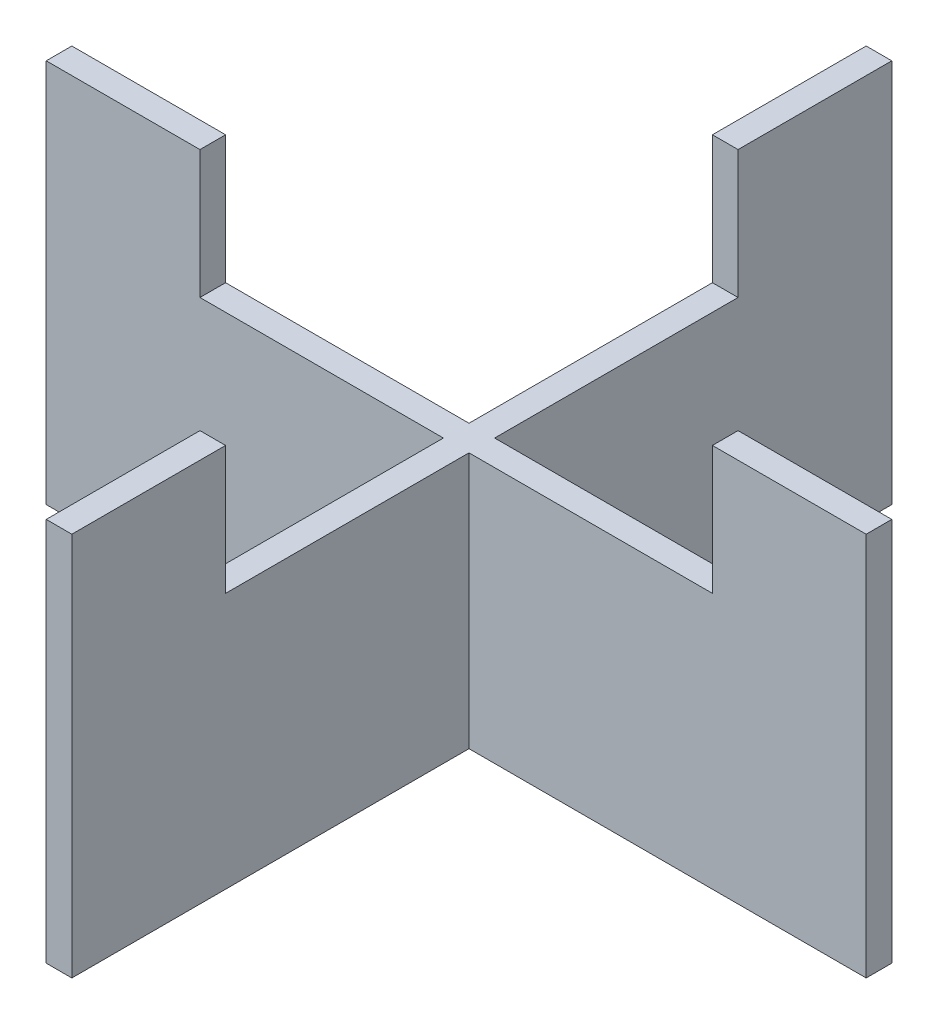
ISO-10303-21;
HEADER;
FILE_DESCRIPTION(('STEP AP214'),'2;1');
FILE_NAME('part.step','',(''),(''),'','','');
FILE_SCHEMA(('AUTOMOTIVE_DESIGN { 1 0 10303 214 1 1 1 1 }'));
ENDSEC;
DATA;
#1=APPLICATION_CONTEXT('core data for automotive mechanical design processes');
#2=APPLICATION_PROTOCOL_DEFINITION('international standard','automotive_design',2000,#1);
#3=PRODUCT_CONTEXT('',#1,'mechanical');
#4=PRODUCT('Part','Part','',(#3));
#5=PRODUCT_RELATED_PRODUCT_CATEGORY('part','',(#4));
#6=PRODUCT_DEFINITION_FORMATION('','',#4);
#7=PRODUCT_DEFINITION_CONTEXT('part definition',#1,'design');
#8=PRODUCT_DEFINITION('design','',#6,#7);
#9=PRODUCT_DEFINITION_SHAPE('','',#8);
#10=(LENGTH_UNIT() NAMED_UNIT(*) SI_UNIT(.MILLI.,.METRE.));
#11=(NAMED_UNIT(*) PLANE_ANGLE_UNIT() SI_UNIT($,.RADIAN.));
#12=(NAMED_UNIT(*) SI_UNIT($,.STERADIAN.) SOLID_ANGLE_UNIT());
#13=UNCERTAINTY_MEASURE_WITH_UNIT(LENGTH_MEASURE(1.E-05),#10,'distance_accuracy_value','');
#14=(GEOMETRIC_REPRESENTATION_CONTEXT(3) GLOBAL_UNCERTAINTY_ASSIGNED_CONTEXT((#13)) GLOBAL_UNIT_ASSIGNED_CONTEXT((#10,
#11,#12)) REPRESENTATION_CONTEXT('',''));
#15=CARTESIAN_POINT('',(0.,0.,0.));
#16=DIRECTION('',(0.,0.,1.));
#17=DIRECTION('',(1.,0.,0.));
#18=AXIS2_PLACEMENT_3D('',#15,#16,#17);
#19=CARTESIAN_POINT('',(0.,15.,0.));
#20=DIRECTION('',(0.,1.,0.));
#21=DIRECTION('',(0.,0.,1.));
#22=AXIS2_PLACEMENT_3D('',#19,#20,#21);
#23=PLANE('',#22);
#24=DIRECTION('',(0.,0.,-1.));
#25=VECTOR('',#24,1.);
#26=CARTESIAN_POINT('',(26.,15.,0.));
#27=LINE('',#26,#25);
#28=CARTESIAN_POINT('',(26.,15.,0.));
#29=VERTEX_POINT('',#28);
#30=CARTESIAN_POINT('',(26.,15.,-0.999999999999997));
#31=VERTEX_POINT('',#30);
#32=EDGE_CURVE('E40',#29,#31,#27,.T.);
#33=ORIENTED_EDGE('',*,*,#32,.F.);
#34=DIRECTION('',(1.,0.,0.));
#35=VECTOR('',#34,1.);
#36=CARTESIAN_POINT('',(16.5,15.,0.));
#37=LINE('',#36,#35);
#38=CARTESIAN_POINT('',(32.,15.,0.));
#39=VERTEX_POINT('',#38);
#40=EDGE_CURVE('E248',#29,#39,#37,.T.);
#41=ORIENTED_EDGE('',*,*,#40,.T.);
#42=DIRECTION('',(0.,0.,-1.));
#43=VECTOR('',#42,1.);
#44=CARTESIAN_POINT('',(32.,15.,0.));
#45=LINE('',#44,#43);
#46=CARTESIAN_POINT('',(32.,15.,-0.999999999999999));
#47=VERTEX_POINT('',#46);
#48=EDGE_CURVE('E246',#39,#47,#45,.T.);
#49=ORIENTED_EDGE('',*,*,#48,.T.);
#50=DIRECTION('',(-1.,0.,0.));
#51=VECTOR('',#50,1.);
#52=CARTESIAN_POINT('',(32.,15.,-0.999999999999999));
#53=LINE('',#52,#51);
#54=EDGE_CURVE('E136',#47,#31,#53,.T.);
#55=ORIENTED_EDGE('',*,*,#54,.T.);
#56=EDGE_LOOP('',(#33,#41,#49,#55));
#57=FACE_BOUND('',#56,.T.);
#58=ADVANCED_FACE('F32',(#57),#23,.T.);
#59=DIRECTION('',(1.,0.,0.));
#60=VECTOR('',#59,1.);
#61=CARTESIAN_POINT('',(0.,15.,9.5));
#62=LINE('',#61,#60);
#63=CARTESIAN_POINT('',(15.5,15.,9.5));
#64=VERTEX_POINT('',#63);
#65=CARTESIAN_POINT('',(16.5,15.,9.5));
#66=VERTEX_POINT('',#65);
#67=EDGE_CURVE('E214',#64,#66,#62,.T.);
#68=ORIENTED_EDGE('',*,*,#67,.F.);
#69=DIRECTION('',(0.,0.,1.));
#70=VECTOR('',#69,1.);
#71=CARTESIAN_POINT('',(15.5,15.,0.));
#72=LINE('',#71,#70);
#73=CARTESIAN_POINT('',(15.5,15.,15.5));
#74=VERTEX_POINT('',#73);
#75=EDGE_CURVE('E257',#64,#74,#72,.T.);
#76=ORIENTED_EDGE('',*,*,#75,.T.);
#77=DIRECTION('',(1.,0.,0.));
#78=VECTOR('',#77,1.);
#79=CARTESIAN_POINT('',(15.5,15.,15.5));
#80=LINE('',#79,#78);
#81=CARTESIAN_POINT('',(16.5,15.,15.5));
#82=VERTEX_POINT('',#81);
#83=EDGE_CURVE('E255',#74,#82,#80,.T.);
#84=ORIENTED_EDGE('',*,*,#83,.T.);
#85=DIRECTION('',(0.,0.,-1.));
#86=VECTOR('',#85,1.);
#87=CARTESIAN_POINT('',(16.5,15.,15.5));
#88=LINE('',#87,#86);
#89=EDGE_CURVE('E252',#82,#66,#88,.T.);
#90=ORIENTED_EDGE('',*,*,#89,.T.);
#91=EDGE_LOOP('',(#68,#76,#84,#90));
#92=FACE_BOUND('',#91,.T.);
#93=ADVANCED_FACE('F352',(#92),#23,.T.);
#94=DIRECTION('',(0.,0.,1.));
#95=VECTOR('',#94,1.);
#96=CARTESIAN_POINT('',(6.,15.,0.));
#97=LINE('',#96,#95);
#98=CARTESIAN_POINT('',(6.,15.,-0.999999999999996));
#99=VERTEX_POINT('',#98);
#100=CARTESIAN_POINT('',(6.,15.,0.));
#101=VERTEX_POINT('',#100);
#102=EDGE_CURVE('E211',#99,#101,#97,.T.);
#103=ORIENTED_EDGE('',*,*,#102,.F.);
#104=DIRECTION('',(-1.,0.,0.));
#105=VECTOR('',#104,1.);
#106=CARTESIAN_POINT('',(15.5,15.,-0.999999999999994));
#107=LINE('',#106,#105);
#108=CARTESIAN_POINT('',(0.,15.,-0.999999999999997));
#109=VERTEX_POINT('',#108);
#110=EDGE_CURVE('E56',#99,#109,#107,.T.);
#111=ORIENTED_EDGE('',*,*,#110,.T.);
#112=DIRECTION('',(0.,0.,1.));
#113=VECTOR('',#112,1.);
#114=CARTESIAN_POINT('',(0.,15.,-0.999999999999997));
#115=LINE('',#114,#113);
#116=CARTESIAN_POINT('',(0.,15.,0.));
#117=VERTEX_POINT('',#116);
#118=EDGE_CURVE('E186',#109,#117,#115,.T.);
#119=ORIENTED_EDGE('',*,*,#118,.T.);
#120=DIRECTION('',(1.,0.,0.));
#121=VECTOR('',#120,1.);
#122=CARTESIAN_POINT('',(0.,15.,0.));
#123=LINE('',#122,#121);
#124=EDGE_CURVE('E110',#117,#101,#123,.T.);
#125=ORIENTED_EDGE('',*,*,#124,.T.);
#126=EDGE_LOOP('',(#103,#111,#119,#125));
#127=FACE_BOUND('',#126,.T.);
#128=ADVANCED_FACE('F383',(#127),#23,.T.);
#129=CARTESIAN_POINT('',(0.,15.,-0.999999999999997));
#130=DIRECTION('',(1.,0.,0.));
#131=DIRECTION('',(0.,0.,-1.));
#132=AXIS2_PLACEMENT_3D('',#129,#130,#131);
#133=PLANE('',#132);
#134=DIRECTION('',(0.,0.,1.));
#135=VECTOR('',#134,1.);
#136=CARTESIAN_POINT('',(0.,0.,-0.999999999999997));
#137=LINE('',#136,#135);
#138=CARTESIAN_POINT('',(0.,0.,-0.999999999999997));
#139=VERTEX_POINT('',#138);
#140=CARTESIAN_POINT('',(0.,0.,0.));
#141=VERTEX_POINT('',#140);
#142=EDGE_CURVE('E158',#139,#141,#137,.T.);
#143=ORIENTED_EDGE('',*,*,#142,.T.);
#144=DIRECTION('',(0.,-1.,0.));
#145=VECTOR('',#144,1.);
#146=CARTESIAN_POINT('',(0.,15.,0.));
#147=LINE('',#146,#145);
#148=EDGE_CURVE('E208',#117,#141,#147,.T.);
#149=ORIENTED_EDGE('',*,*,#148,.F.);
#150=ORIENTED_EDGE('',*,*,#118,.F.);
#151=DIRECTION('',(0.,-1.,0.));
#152=VECTOR('',#151,1.);
#153=CARTESIAN_POINT('',(0.,15.,-0.999999999999997));
#154=LINE('',#153,#152);
#155=EDGE_CURVE('E157',#109,#139,#154,.T.);
#156=ORIENTED_EDGE('',*,*,#155,.T.);
#157=EDGE_LOOP('',(#143,#149,#150,#156));
#158=FACE_BOUND('',#157,.T.);
#159=ADVANCED_FACE('F34',(#158),#133,.F.);
#160=CARTESIAN_POINT('',(0.,15.,0.));
#161=DIRECTION('',(0.,0.,-1.));
#162=DIRECTION('',(-1.,0.,0.));
#163=AXIS2_PLACEMENT_3D('',#160,#161,#162);
#164=PLANE('',#163);
#165=DIRECTION('',(1.,0.,0.));
#166=VECTOR('',#165,1.);
#167=CARTESIAN_POINT('',(0.,10.,0.));
#168=LINE('',#167,#166);
#169=CARTESIAN_POINT('',(6.,10.,0.));
#170=VERTEX_POINT('',#169);
#171=CARTESIAN_POINT('',(15.5,10.,0.));
#172=VERTEX_POINT('',#171);
#173=EDGE_CURVE('E162',#170,#172,#168,.T.);
#174=ORIENTED_EDGE('',*,*,#173,.F.);
#175=DIRECTION('',(0.,1.,0.));
#176=VECTOR('',#175,1.);
#177=CARTESIAN_POINT('',(6.,15.,0.));
#178=LINE('',#177,#176);
#179=EDGE_CURVE('E285',#170,#101,#178,.T.);
#180=ORIENTED_EDGE('',*,*,#179,.T.);
#181=ORIENTED_EDGE('',*,*,#124,.F.);
#182=ORIENTED_EDGE('',*,*,#148,.T.);
#183=DIRECTION('',(1.,0.,0.));
#184=VECTOR('',#183,1.);
#185=CARTESIAN_POINT('',(0.,0.,0.));
#186=LINE('',#185,#184);
#187=CARTESIAN_POINT('',(15.5,0.,0.));
#188=VERTEX_POINT('',#187);
#189=EDGE_CURVE('E161',#141,#188,#186,.T.);
#190=ORIENTED_EDGE('',*,*,#189,.T.);
#191=DIRECTION('',(0.,-1.,0.));
#192=VECTOR('',#191,1.);
#193=CARTESIAN_POINT('',(15.5,15.,0.));
#194=LINE('',#193,#192);
#195=EDGE_CURVE('E206',#172,#188,#194,.T.);
#196=ORIENTED_EDGE('',*,*,#195,.F.);
#197=EDGE_LOOP('',(#174,#180,#181,#182,#190,#196));
#198=FACE_BOUND('',#197,.T.);
#199=ADVANCED_FACE('F336',(#198),#164,.F.);
#200=CARTESIAN_POINT('',(15.5,15.,0.));
#201=DIRECTION('',(1.,0.,0.));
#202=DIRECTION('',(0.,0.,-1.));
#203=AXIS2_PLACEMENT_3D('',#200,#201,#202);
#204=PLANE('',#203);
#205=ORIENTED_EDGE('',*,*,#75,.F.);
#206=DIRECTION('',(0.,-1.,0.));
#207=VECTOR('',#206,1.);
#208=CARTESIAN_POINT('',(15.5,15.,9.5));
#209=LINE('',#208,#207);
#210=CARTESIAN_POINT('',(15.5,10.,9.5));
#211=VERTEX_POINT('',#210);
#212=EDGE_CURVE('E243',#64,#211,#209,.T.);
#213=ORIENTED_EDGE('',*,*,#212,.T.);
#214=DIRECTION('',(0.,0.,1.));
#215=VECTOR('',#214,1.);
#216=CARTESIAN_POINT('',(15.5,10.,0.));
#217=LINE('',#216,#215);
#218=EDGE_CURVE('E263',#172,#211,#217,.T.);
#219=ORIENTED_EDGE('',*,*,#218,.F.);
#220=ORIENTED_EDGE('',*,*,#195,.T.);
#221=DIRECTION('',(0.,0.,1.));
#222=VECTOR('',#221,1.);
#223=CARTESIAN_POINT('',(15.5,0.,0.));
#224=LINE('',#223,#222);
#225=CARTESIAN_POINT('',(15.5,0.,15.5));
#226=VERTEX_POINT('',#225);
#227=EDGE_CURVE('E165',#188,#226,#224,.T.);
#228=ORIENTED_EDGE('',*,*,#227,.T.);
#229=DIRECTION('',(0.,-1.,0.));
#230=VECTOR('',#229,1.);
#231=CARTESIAN_POINT('',(15.5,15.,15.5));
#232=LINE('',#231,#230);
#233=EDGE_CURVE('E203',#74,#226,#232,.T.);
#234=ORIENTED_EDGE('',*,*,#233,.F.);
#235=EDGE_LOOP('',(#205,#213,#219,#220,#228,#234));
#236=FACE_BOUND('',#235,.T.);
#237=ADVANCED_FACE('F334',(#236),#204,.F.);
#238=CARTESIAN_POINT('',(15.5,15.,15.5));
#239=DIRECTION('',(0.,0.,-1.));
#240=DIRECTION('',(-1.,0.,0.));
#241=AXIS2_PLACEMENT_3D('',#238,#239,#240);
#242=PLANE('',#241);
#243=DIRECTION('',(1.,0.,0.));
#244=VECTOR('',#243,1.);
#245=CARTESIAN_POINT('',(15.5,0.,15.5));
#246=LINE('',#245,#244);
#247=CARTESIAN_POINT('',(16.5,0.,15.5));
#248=VERTEX_POINT('',#247);
#249=EDGE_CURVE('E167',#226,#248,#246,.T.);
#250=ORIENTED_EDGE('',*,*,#249,.T.);
#251=DIRECTION('',(0.,-1.,0.));
#252=VECTOR('',#251,1.);
#253=CARTESIAN_POINT('',(16.5,15.,15.5));
#254=LINE('',#253,#252);
#255=EDGE_CURVE('E200',#82,#248,#254,.T.);
#256=ORIENTED_EDGE('',*,*,#255,.F.);
#257=ORIENTED_EDGE('',*,*,#83,.F.);
#258=ORIENTED_EDGE('',*,*,#233,.T.);
#259=EDGE_LOOP('',(#250,#256,#257,#258));
#260=FACE_BOUND('',#259,.T.);
#261=ADVANCED_FACE('F347',(#260),#242,.F.);
#262=CARTESIAN_POINT('',(16.5,15.,15.5));
#263=DIRECTION('',(-1.,0.,0.));
#264=DIRECTION('',(0.,0.,1.));
#265=AXIS2_PLACEMENT_3D('',#262,#263,#264);
#266=PLANE('',#265);
#267=DIRECTION('',(0.,0.,-1.));
#268=VECTOR('',#267,1.);
#269=CARTESIAN_POINT('',(16.5,10.,15.5));
#270=LINE('',#269,#268);
#271=CARTESIAN_POINT('',(16.5,10.,9.5));
#272=VERTEX_POINT('',#271);
#273=CARTESIAN_POINT('',(16.5,10.,0.));
#274=VERTEX_POINT('',#273);
#275=EDGE_CURVE('E266',#272,#274,#270,.T.);
#276=ORIENTED_EDGE('',*,*,#275,.F.);
#277=DIRECTION('',(0.,1.,0.));
#278=VECTOR('',#277,1.);
#279=CARTESIAN_POINT('',(16.5,15.,9.5));
#280=LINE('',#279,#278);
#281=EDGE_CURVE('E282',#272,#66,#280,.T.);
#282=ORIENTED_EDGE('',*,*,#281,.T.);
#283=ORIENTED_EDGE('',*,*,#89,.F.);
#284=ORIENTED_EDGE('',*,*,#255,.T.);
#285=DIRECTION('',(0.,0.,-1.));
#286=VECTOR('',#285,1.);
#287=CARTESIAN_POINT('',(16.5,0.,15.5));
#288=LINE('',#287,#286);
#289=CARTESIAN_POINT('',(16.5,0.,0.));
#290=VERTEX_POINT('',#289);
#291=EDGE_CURVE('E169',#248,#290,#288,.T.);
#292=ORIENTED_EDGE('',*,*,#291,.T.);
#293=DIRECTION('',(0.,-1.,0.));
#294=VECTOR('',#293,1.);
#295=CARTESIAN_POINT('',(16.5,15.,0.));
#296=LINE('',#295,#294);
#297=EDGE_CURVE('E198',#274,#290,#296,.T.);
#298=ORIENTED_EDGE('',*,*,#297,.F.);
#299=EDGE_LOOP('',(#276,#282,#283,#284,#292,#298));
#300=FACE_BOUND('',#299,.T.);
#301=ADVANCED_FACE('F399',(#300),#266,.F.);
#302=CARTESIAN_POINT('',(16.5,15.,0.));
#303=DIRECTION('',(0.,0.,-1.));
#304=DIRECTION('',(-1.,0.,0.));
#305=AXIS2_PLACEMENT_3D('',#302,#303,#304);
#306=PLANE('',#305);
#307=ORIENTED_EDGE('',*,*,#40,.F.);
#308=DIRECTION('',(0.,-1.,0.));
#309=VECTOR('',#308,1.);
#310=CARTESIAN_POINT('',(26.,15.,0.));
#311=LINE('',#310,#309);
#312=CARTESIAN_POINT('',(26.,10.,0.));
#313=VERTEX_POINT('',#312);
#314=EDGE_CURVE('E230',#29,#313,#311,.T.);
#315=ORIENTED_EDGE('',*,*,#314,.T.);
#316=DIRECTION('',(1.,0.,0.));
#317=VECTOR('',#316,1.);
#318=CARTESIAN_POINT('',(16.5,10.,0.));
#319=LINE('',#318,#317);
#320=EDGE_CURVE('E269',#274,#313,#319,.T.);
#321=ORIENTED_EDGE('',*,*,#320,.F.);
#322=ORIENTED_EDGE('',*,*,#297,.T.);
#323=DIRECTION('',(1.,0.,0.));
#324=VECTOR('',#323,1.);
#325=CARTESIAN_POINT('',(16.5,0.,0.));
#326=LINE('',#325,#324);
#327=CARTESIAN_POINT('',(32.,0.,0.));
#328=VERTEX_POINT('',#327);
#329=EDGE_CURVE('E172',#290,#328,#326,.T.);
#330=ORIENTED_EDGE('',*,*,#329,.T.);
#331=DIRECTION('',(0.,-1.,0.));
#332=VECTOR('',#331,1.);
#333=CARTESIAN_POINT('',(32.,15.,0.));
#334=LINE('',#333,#332);
#335=EDGE_CURVE('E195',#39,#328,#334,.T.);
#336=ORIENTED_EDGE('',*,*,#335,.F.);
#337=EDGE_LOOP('',(#307,#315,#321,#322,#330,#336));
#338=FACE_BOUND('',#337,.T.);
#339=ADVANCED_FACE('F313',(#338),#306,.F.);
#340=CARTESIAN_POINT('',(32.,15.,0.));
#341=DIRECTION('',(-1.,0.,0.));
#342=DIRECTION('',(0.,0.,1.));
#343=AXIS2_PLACEMENT_3D('',#340,#341,#342);
#344=PLANE('',#343);
#345=DIRECTION('',(0.,0.,-1.));
#346=VECTOR('',#345,1.);
#347=CARTESIAN_POINT('',(32.,0.,0.));
#348=LINE('',#347,#346);
#349=CARTESIAN_POINT('',(32.,0.,-0.999999999999999));
#350=VERTEX_POINT('',#349);
#351=EDGE_CURVE('E174',#328,#350,#348,.T.);
#352=ORIENTED_EDGE('',*,*,#351,.T.);
#353=DIRECTION('',(0.,-1.,0.));
#354=VECTOR('',#353,1.);
#355=CARTESIAN_POINT('',(32.,15.,-0.999999999999999));
#356=LINE('',#355,#354);
#357=EDGE_CURVE('E192',#47,#350,#356,.T.);
#358=ORIENTED_EDGE('',*,*,#357,.F.);
#359=ORIENTED_EDGE('',*,*,#48,.F.);
#360=ORIENTED_EDGE('',*,*,#335,.T.);
#361=EDGE_LOOP('',(#352,#358,#359,#360));
#362=FACE_BOUND('',#361,.T.);
#363=ADVANCED_FACE('F391',(#362),#344,.F.);
#364=CARTESIAN_POINT('',(32.,15.,-0.999999999999999));
#365=DIRECTION('',(0.,0.,1.));
#366=DIRECTION('',(1.,0.,0.));
#367=AXIS2_PLACEMENT_3D('',#364,#365,#366);
#368=PLANE('',#367);
#369=DIRECTION('',(-1.,0.,0.));
#370=VECTOR('',#369,1.);
#371=CARTESIAN_POINT('',(32.,10.,-0.999999999999999));
#372=LINE('',#371,#370);
#373=CARTESIAN_POINT('',(26.,10.,-0.999999999999997));
#374=VERTEX_POINT('',#373);
#375=CARTESIAN_POINT('',(16.5,10.,-0.999999999999996));
#376=VERTEX_POINT('',#375);
#377=EDGE_CURVE('E242',#374,#376,#372,.T.);
#378=ORIENTED_EDGE('',*,*,#377,.F.);
#379=DIRECTION('',(0.,1.,0.));
#380=VECTOR('',#379,1.);
#381=CARTESIAN_POINT('',(26.,15.,-0.999999999999998));
#382=LINE('',#381,#380);
#383=EDGE_CURVE('E226',#374,#31,#382,.T.);
#384=ORIENTED_EDGE('',*,*,#383,.T.);
#385=ORIENTED_EDGE('',*,*,#54,.F.);
#386=ORIENTED_EDGE('',*,*,#357,.T.);
#387=DIRECTION('',(-1.,0.,0.));
#388=VECTOR('',#387,1.);
#389=CARTESIAN_POINT('',(32.,0.,-0.999999999999999));
#390=LINE('',#389,#388);
#391=CARTESIAN_POINT('',(16.5,0.,-0.999999999999996));
#392=VERTEX_POINT('',#391);
#393=EDGE_CURVE('E176',#350,#392,#390,.T.);
#394=ORIENTED_EDGE('',*,*,#393,.T.);
#395=DIRECTION('',(0.,-1.,0.));
#396=VECTOR('',#395,1.);
#397=CARTESIAN_POINT('',(16.5,15.,-0.999999999999996));
#398=LINE('',#397,#396);
#399=EDGE_CURVE('E145',#376,#392,#398,.T.);
#400=ORIENTED_EDGE('',*,*,#399,.F.);
#401=EDGE_LOOP('',(#378,#384,#385,#386,#394,#400));
#402=FACE_BOUND('',#401,.T.);
#403=ADVANCED_FACE('F239',(#402),#368,.F.);
#404=CARTESIAN_POINT('',(16.5,15.,-0.999999999999996));
#405=DIRECTION('',(-1.,0.,0.));
#406=DIRECTION('',(0.,0.,1.));
#407=AXIS2_PLACEMENT_3D('',#404,#405,#406);
#408=PLANE('',#407);
#409=DIRECTION('',(0.,0.,-1.));
#410=VECTOR('',#409,1.);
#411=CARTESIAN_POINT('',(16.5,15.,-0.999999999999996));
#412=LINE('',#411,#410);
#413=CARTESIAN_POINT('',(16.5,15.,-10.5));
#414=VERTEX_POINT('',#413);
#415=CARTESIAN_POINT('',(16.5,15.,-16.5));
#416=VERTEX_POINT('',#415);
#417=EDGE_CURVE('E127',#414,#416,#412,.T.);
#418=ORIENTED_EDGE('',*,*,#417,.F.);
#419=DIRECTION('',(0.,-1.,0.));
#420=VECTOR('',#419,1.);
#421=CARTESIAN_POINT('',(16.5,15.,-10.5));
#422=LINE('',#421,#420);
#423=CARTESIAN_POINT('',(16.5,10.,-10.5));
#424=VERTEX_POINT('',#423);
#425=EDGE_CURVE('E47',#414,#424,#422,.T.);
#426=ORIENTED_EDGE('',*,*,#425,.T.);
#427=DIRECTION('',(0.,0.,-1.));
#428=VECTOR('',#427,1.);
#429=CARTESIAN_POINT('',(16.5,10.,-0.999999999999996));
#430=LINE('',#429,#428);
#431=EDGE_CURVE('E273',#376,#424,#430,.T.);
#432=ORIENTED_EDGE('',*,*,#431,.F.);
#433=ORIENTED_EDGE('',*,*,#399,.T.);
#434=DIRECTION('',(0.,0.,-1.));
#435=VECTOR('',#434,1.);
#436=CARTESIAN_POINT('',(16.5,0.,-0.999999999999996));
#437=LINE('',#436,#435);
#438=CARTESIAN_POINT('',(16.5,0.,-16.5));
#439=VERTEX_POINT('',#438);
#440=EDGE_CURVE('E142',#392,#439,#437,.T.);
#441=ORIENTED_EDGE('',*,*,#440,.T.);
#442=DIRECTION('',(0.,-1.,0.));
#443=VECTOR('',#442,1.);
#444=CARTESIAN_POINT('',(16.5,15.,-16.5));
#445=LINE('',#444,#443);
#446=EDGE_CURVE('E139',#416,#439,#445,.T.);
#447=ORIENTED_EDGE('',*,*,#446,.F.);
#448=EDGE_LOOP('',(#418,#426,#432,#433,#441,#447));
#449=FACE_BOUND('',#448,.T.);
#450=ADVANCED_FACE('F140',(#449),#408,.F.);
#451=CARTESIAN_POINT('',(16.5,15.,-16.5));
#452=DIRECTION('',(0.,0.,1.));
#453=DIRECTION('',(1.,0.,0.));
#454=AXIS2_PLACEMENT_3D('',#451,#452,#453);
#455=PLANE('',#454);
#456=DIRECTION('',(-1.,0.,0.));
#457=VECTOR('',#456,1.);
#458=CARTESIAN_POINT('',(16.5,0.,-16.5));
#459=LINE('',#458,#457);
#460=CARTESIAN_POINT('',(15.5,0.,-16.5));
#461=VERTEX_POINT('',#460);
#462=EDGE_CURVE('E180',#439,#461,#459,.T.);
#463=ORIENTED_EDGE('',*,*,#462,.T.);
#464=DIRECTION('',(0.,-1.,0.));
#465=VECTOR('',#464,1.);
#466=CARTESIAN_POINT('',(15.5,15.,-16.5));
#467=LINE('',#466,#465);
#468=CARTESIAN_POINT('',(15.5,15.,-16.5));
#469=VERTEX_POINT('',#468);
#470=EDGE_CURVE('E146',#469,#461,#467,.T.);
#471=ORIENTED_EDGE('',*,*,#470,.F.);
#472=DIRECTION('',(-1.,0.,0.));
#473=VECTOR('',#472,1.);
#474=CARTESIAN_POINT('',(16.5,15.,-16.5));
#475=LINE('',#474,#473);
#476=EDGE_CURVE('E132',#416,#469,#475,.T.);
#477=ORIENTED_EDGE('',*,*,#476,.F.);
#478=ORIENTED_EDGE('',*,*,#446,.T.);
#479=EDGE_LOOP('',(#463,#471,#477,#478));
#480=FACE_BOUND('',#479,.T.);
#481=ADVANCED_FACE('F148',(#480),#455,.F.);
#482=CARTESIAN_POINT('',(15.5,15.,-16.5));
#483=DIRECTION('',(1.,0.,0.));
#484=DIRECTION('',(0.,0.,-1.));
#485=AXIS2_PLACEMENT_3D('',#482,#483,#484);
#486=PLANE('',#485);
#487=DIRECTION('',(0.,0.,1.));
#488=VECTOR('',#487,1.);
#489=CARTESIAN_POINT('',(15.5,10.,-16.5));
#490=LINE('',#489,#488);
#491=CARTESIAN_POINT('',(15.5,10.,-10.5));
#492=VERTEX_POINT('',#491);
#493=CARTESIAN_POINT('',(15.5,10.,-0.999999999999994));
#494=VERTEX_POINT('',#493);
#495=EDGE_CURVE('E276',#492,#494,#490,.T.);
#496=ORIENTED_EDGE('',*,*,#495,.F.);
#497=DIRECTION('',(0.,1.,0.));
#498=VECTOR('',#497,1.);
#499=CARTESIAN_POINT('',(15.5,15.,-10.5));
#500=LINE('',#499,#498);
#501=CARTESIAN_POINT('',(15.5,15.,-10.5));
#502=VERTEX_POINT('',#501);
#503=EDGE_CURVE('E291',#492,#502,#500,.T.);
#504=ORIENTED_EDGE('',*,*,#503,.T.);
#505=DIRECTION('',(0.,0.,1.));
#506=VECTOR('',#505,1.);
#507=CARTESIAN_POINT('',(15.5,15.,-16.5));
#508=LINE('',#507,#506);
#509=EDGE_CURVE('E151',#469,#502,#508,.T.);
#510=ORIENTED_EDGE('',*,*,#509,.F.);
#511=ORIENTED_EDGE('',*,*,#470,.T.);
#512=DIRECTION('',(0.,0.,1.));
#513=VECTOR('',#512,1.);
#514=CARTESIAN_POINT('',(15.5,0.,-16.5));
#515=LINE('',#514,#513);
#516=CARTESIAN_POINT('',(15.5,0.,-0.999999999999994));
#517=VERTEX_POINT('',#516);
#518=EDGE_CURVE('E182',#461,#517,#515,.T.);
#519=ORIENTED_EDGE('',*,*,#518,.T.);
#520=DIRECTION('',(0.,-1.,0.));
#521=VECTOR('',#520,1.);
#522=CARTESIAN_POINT('',(15.5,15.,-0.999999999999994));
#523=LINE('',#522,#521);
#524=EDGE_CURVE('E188',#494,#517,#523,.T.);
#525=ORIENTED_EDGE('',*,*,#524,.F.);
#526=EDGE_LOOP('',(#496,#504,#510,#511,#519,#525));
#527=FACE_BOUND('',#526,.T.);
#528=ADVANCED_FACE('F377',(#527),#486,.F.);
#529=CARTESIAN_POINT('',(15.5,15.,-0.999999999999994));
#530=DIRECTION('',(0.,0.,1.));
#531=DIRECTION('',(1.,0.,0.));
#532=AXIS2_PLACEMENT_3D('',#529,#530,#531);
#533=PLANE('',#532);
#534=ORIENTED_EDGE('',*,*,#110,.F.);
#535=DIRECTION('',(0.,-1.,0.));
#536=VECTOR('',#535,1.);
#537=CARTESIAN_POINT('',(6.,15.,-0.999999999999996));
#538=LINE('',#537,#536);
#539=CARTESIAN_POINT('',(6.,10.,-0.999999999999996));
#540=VERTEX_POINT('',#539);
#541=EDGE_CURVE('E287',#99,#540,#538,.T.);
#542=ORIENTED_EDGE('',*,*,#541,.T.);
#543=DIRECTION('',(-1.,0.,0.));
#544=VECTOR('',#543,1.);
#545=CARTESIAN_POINT('',(15.5,10.,-0.999999999999994));
#546=LINE('',#545,#544);
#547=EDGE_CURVE('E11',#494,#540,#546,.T.);
#548=ORIENTED_EDGE('',*,*,#547,.F.);
#549=ORIENTED_EDGE('',*,*,#524,.T.);
#550=DIRECTION('',(-1.,0.,0.));
#551=VECTOR('',#550,1.);
#552=CARTESIAN_POINT('',(15.5,0.,-0.999999999999994));
#553=LINE('',#552,#551);
#554=EDGE_CURVE('E101',#517,#139,#553,.T.);
#555=ORIENTED_EDGE('',*,*,#554,.T.);
#556=ORIENTED_EDGE('',*,*,#155,.F.);
#557=EDGE_LOOP('',(#534,#542,#548,#549,#555,#556));
#558=FACE_BOUND('',#557,.T.);
#559=ADVANCED_FACE('F380',(#558),#533,.F.);
#560=DIRECTION('',(-1.,0.,0.));
#561=VECTOR('',#560,1.);
#562=CARTESIAN_POINT('',(0.,15.,-10.5));
#563=LINE('',#562,#561);
#564=EDGE_CURVE('E134',#414,#502,#563,.T.);
#565=ORIENTED_EDGE('',*,*,#564,.F.);
#566=ORIENTED_EDGE('',*,*,#417,.T.);
#567=ORIENTED_EDGE('',*,*,#476,.T.);
#568=ORIENTED_EDGE('',*,*,#509,.T.);
#569=EDGE_LOOP('',(#565,#566,#567,#568));
#570=FACE_BOUND('',#569,.T.);
#571=ADVANCED_FACE('F129',(#570),#23,.T.);
#572=CARTESIAN_POINT('',(0.,0.,0.));
#573=DIRECTION('',(0.,1.,0.));
#574=DIRECTION('',(0.,0.,1.));
#575=AXIS2_PLACEMENT_3D('',#572,#573,#574);
#576=PLANE('',#575);
#577=ORIENTED_EDGE('',*,*,#142,.F.);
#578=ORIENTED_EDGE('',*,*,#554,.F.);
#579=ORIENTED_EDGE('',*,*,#518,.F.);
#580=ORIENTED_EDGE('',*,*,#462,.F.);
#581=ORIENTED_EDGE('',*,*,#440,.F.);
#582=ORIENTED_EDGE('',*,*,#393,.F.);
#583=ORIENTED_EDGE('',*,*,#351,.F.);
#584=ORIENTED_EDGE('',*,*,#329,.F.);
#585=ORIENTED_EDGE('',*,*,#291,.F.);
#586=ORIENTED_EDGE('',*,*,#249,.F.);
#587=ORIENTED_EDGE('',*,*,#227,.F.);
#588=ORIENTED_EDGE('',*,*,#189,.F.);
#589=EDGE_LOOP('',(#577,#578,#579,#580,#581,#582,#583,#584,#585,#586,#587,#588));
#590=FACE_BOUND('',#589,.T.);
#591=ADVANCED_FACE('F342',(#590),#576,.F.);
#592=CARTESIAN_POINT('',(0.,10.,0.));
#593=DIRECTION('',(0.,1.,0.));
#594=DIRECTION('',(0.,0.,1.));
#595=AXIS2_PLACEMENT_3D('',#592,#593,#594);
#596=PLANE('',#595);
#597=ORIENTED_EDGE('',*,*,#173,.T.);
#598=ORIENTED_EDGE('',*,*,#218,.T.);
#599=DIRECTION('',(1.,0.,0.));
#600=VECTOR('',#599,1.);
#601=CARTESIAN_POINT('',(6.,10.,9.5));
#602=LINE('',#601,#600);
#603=EDGE_CURVE('E294',#211,#272,#602,.T.);
#604=ORIENTED_EDGE('',*,*,#603,.T.);
#605=ORIENTED_EDGE('',*,*,#275,.T.);
#606=ORIENTED_EDGE('',*,*,#320,.T.);
#607=DIRECTION('',(0.,0.,-1.));
#608=VECTOR('',#607,1.);
#609=CARTESIAN_POINT('',(26.,10.,-10.5));
#610=LINE('',#609,#608);
#611=EDGE_CURVE('E303',#313,#374,#610,.T.);
#612=ORIENTED_EDGE('',*,*,#611,.T.);
#613=ORIENTED_EDGE('',*,*,#377,.T.);
#614=ORIENTED_EDGE('',*,*,#431,.T.);
#615=DIRECTION('',(-1.,0.,0.));
#616=VECTOR('',#615,1.);
#617=CARTESIAN_POINT('',(6.,10.,-10.5));
#618=LINE('',#617,#616);
#619=EDGE_CURVE('E300',#424,#492,#618,.T.);
#620=ORIENTED_EDGE('',*,*,#619,.T.);
#621=ORIENTED_EDGE('',*,*,#495,.T.);
#622=ORIENTED_EDGE('',*,*,#547,.T.);
#623=DIRECTION('',(0.,0.,1.));
#624=VECTOR('',#623,1.);
#625=CARTESIAN_POINT('',(6.,10.,-10.5));
#626=LINE('',#625,#624);
#627=EDGE_CURVE('E297',#540,#170,#626,.T.);
#628=ORIENTED_EDGE('',*,*,#627,.T.);
#629=EDGE_LOOP('',(#597,#598,#604,#605,#606,#612,#613,#614,#620,#621,#622,#628));
#630=FACE_BOUND('',#629,.T.);
#631=ADVANCED_FACE('F305',(#630),#596,.T.);
#632=CARTESIAN_POINT('',(26.,10.,-10.5));
#633=DIRECTION('',(1.,0.,0.));
#634=DIRECTION('',(0.,0.,-1.));
#635=AXIS2_PLACEMENT_3D('',#632,#633,#634);
#636=PLANE('',#635);
#637=ORIENTED_EDGE('',*,*,#32,.T.);
#638=ORIENTED_EDGE('',*,*,#383,.F.);
#639=ORIENTED_EDGE('',*,*,#611,.F.);
#640=ORIENTED_EDGE('',*,*,#314,.F.);
#641=EDGE_LOOP('',(#637,#638,#639,#640));
#642=FACE_BOUND('',#641,.T.);
#643=ADVANCED_FACE('F223',(#642),#636,.F.);
#644=CARTESIAN_POINT('',(6.,10.,9.5));
#645=DIRECTION('',(0.,0.,1.));
#646=DIRECTION('',(1.,0.,0.));
#647=AXIS2_PLACEMENT_3D('',#644,#645,#646);
#648=PLANE('',#647);
#649=ORIENTED_EDGE('',*,*,#67,.T.);
#650=ORIENTED_EDGE('',*,*,#281,.F.);
#651=ORIENTED_EDGE('',*,*,#603,.F.);
#652=ORIENTED_EDGE('',*,*,#212,.F.);
#653=EDGE_LOOP('',(#649,#650,#651,#652));
#654=FACE_BOUND('',#653,.T.);
#655=ADVANCED_FACE('F432',(#654),#648,.F.);
#656=CARTESIAN_POINT('',(6.,10.,-10.5));
#657=DIRECTION('',(-1.,0.,0.));
#658=DIRECTION('',(0.,0.,1.));
#659=AXIS2_PLACEMENT_3D('',#656,#657,#658);
#660=PLANE('',#659);
#661=ORIENTED_EDGE('',*,*,#627,.F.);
#662=ORIENTED_EDGE('',*,*,#541,.F.);
#663=ORIENTED_EDGE('',*,*,#102,.T.);
#664=ORIENTED_EDGE('',*,*,#179,.F.);
#665=EDGE_LOOP('',(#661,#662,#663,#664));
#666=FACE_BOUND('',#665,.T.);
#667=ADVANCED_FACE('F382',(#666),#660,.F.);
#668=CARTESIAN_POINT('',(6.,10.,-10.5));
#669=DIRECTION('',(0.,0.,-1.));
#670=DIRECTION('',(-1.,0.,0.));
#671=AXIS2_PLACEMENT_3D('',#668,#669,#670);
#672=PLANE('',#671);
#673=ORIENTED_EDGE('',*,*,#564,.T.);
#674=ORIENTED_EDGE('',*,*,#503,.F.);
#675=ORIENTED_EDGE('',*,*,#619,.F.);
#676=ORIENTED_EDGE('',*,*,#425,.F.);
#677=EDGE_LOOP('',(#673,#674,#675,#676));
#678=FACE_BOUND('',#677,.T.);
#679=ADVANCED_FACE('F374',(#678),#672,.F.);
#680=CLOSED_SHELL('',(#58,#93,#128,#159,#199,#237,#261,#301,#339,#363,#403,#450,#481,#528,#559,
#571,#591,#631,#643,#655,#667,#679));
#681=MANIFOLD_SOLID_BREP('B2',#680);
#682=ADVANCED_BREP_SHAPE_REPRESENTATION('',(#18,#681),#14);
#683=SHAPE_DEFINITION_REPRESENTATION(#9,#682);
ENDSEC;
END-ISO-10303-21;
